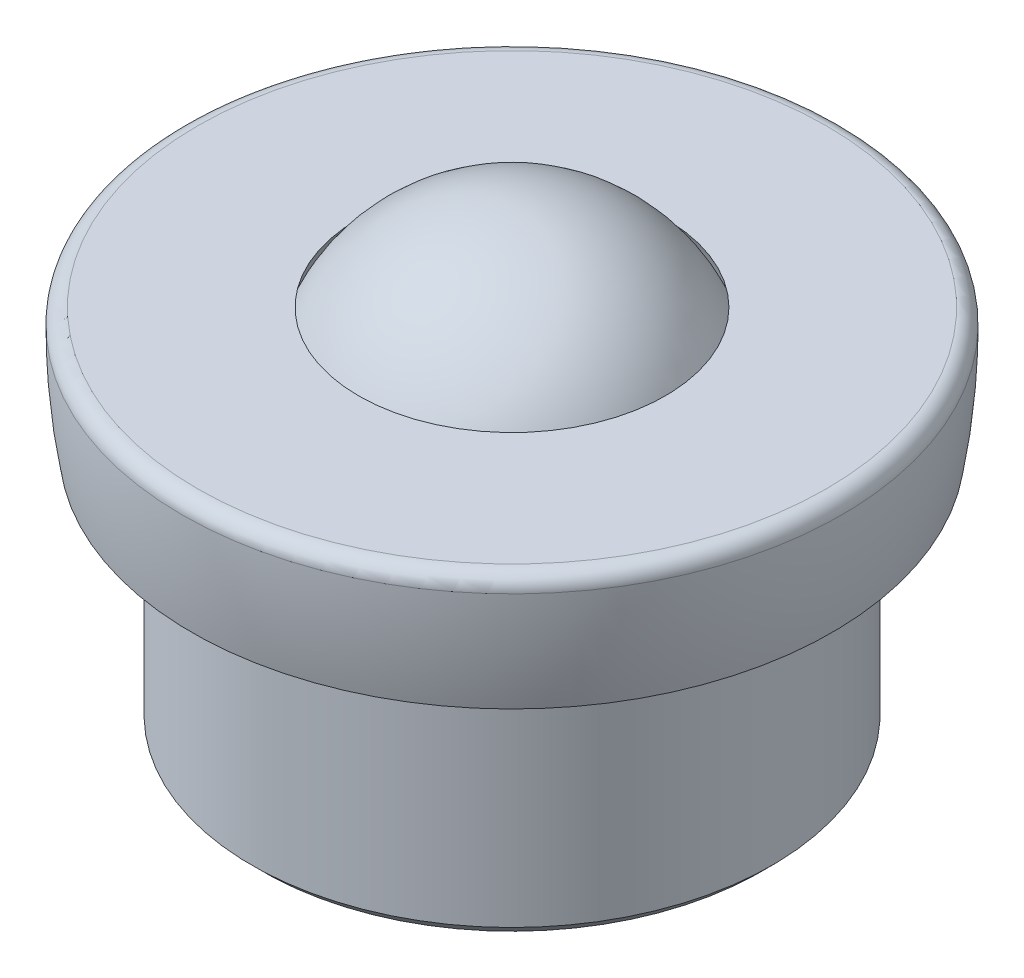
ISO-10303-21;
HEADER;
FILE_DESCRIPTION(('STEP AP214'),'2;1');
FILE_NAME('part.step','',(''),(''),'','','');
FILE_SCHEMA(('AUTOMOTIVE_DESIGN { 1 0 10303 214 1 1 1 1 }'));
ENDSEC;
DATA;
#1=APPLICATION_CONTEXT('core data for automotive mechanical design processes');
#2=APPLICATION_PROTOCOL_DEFINITION('international standard','automotive_design',2000,#1);
#3=PRODUCT_CONTEXT('',#1,'mechanical');
#4=PRODUCT('Part','Part','',(#3));
#5=PRODUCT_RELATED_PRODUCT_CATEGORY('part','',(#4));
#6=PRODUCT_DEFINITION_FORMATION('','',#4);
#7=PRODUCT_DEFINITION_CONTEXT('part definition',#1,'design');
#8=PRODUCT_DEFINITION('design','',#6,#7);
#9=PRODUCT_DEFINITION_SHAPE('','',#8);
#10=(LENGTH_UNIT() NAMED_UNIT(*) SI_UNIT(.MILLI.,.METRE.));
#11=(NAMED_UNIT(*) PLANE_ANGLE_UNIT() SI_UNIT($,.RADIAN.));
#12=(NAMED_UNIT(*) SI_UNIT($,.STERADIAN.) SOLID_ANGLE_UNIT());
#13=UNCERTAINTY_MEASURE_WITH_UNIT(LENGTH_MEASURE(1.E-05),#10,'distance_accuracy_value','');
#14=(GEOMETRIC_REPRESENTATION_CONTEXT(3) GLOBAL_UNCERTAINTY_ASSIGNED_CONTEXT((#13)) GLOBAL_UNIT_ASSIGNED_CONTEXT((#10,
#11,#12)) REPRESENTATION_CONTEXT('',''));
#15=CARTESIAN_POINT('',(0.,0.,0.));
#16=DIRECTION('',(0.,0.,1.));
#17=DIRECTION('',(1.,0.,0.));
#18=AXIS2_PLACEMENT_3D('',#15,#16,#17);
#19=CARTESIAN_POINT('',(0.,-12.7,-11.39825));
#20=DIRECTION('',(0.,-1.,0.));
#21=DIRECTION('',(0.,0.,-1.));
#22=AXIS2_PLACEMENT_3D('',#19,#20,#21);
#23=PLANE('',#22);
#24=CARTESIAN_POINT('',(0.,-12.7,0.));
#25=DIRECTION('',(0.,-1.,0.));
#26=DIRECTION('',(0.,0.,-1.));
#27=AXIS2_PLACEMENT_3D('',#24,#25,#26);
#28=CIRCLE('',#27,11.39825);
#29=CARTESIAN_POINT('',(0.,-12.7,-11.39825));
#30=VERTEX_POINT('',#29);
#31=EDGE_CURVE('E67',#30,#30,#28,.T.);
#32=ORIENTED_EDGE('',*,*,#31,.T.);
#33=EDGE_LOOP('',(#32));
#34=FACE_BOUND('',#33,.T.);
#35=ADVANCED_FACE('F51',(#34),#23,.T.);
#36=CARTESIAN_POINT('',(0.,0.,0.));
#37=DIRECTION('',(0.,1.,0.));
#38=DIRECTION('',(-1.,0.,0.));
#39=AXIS2_PLACEMENT_3D('',#36,#37,#38);
#40=SPHERICAL_SURFACE('',#39,8.0645);
#41=CARTESIAN_POINT('',(0.,3.96875,0.));
#42=DIRECTION('',(0.,1.,0.));
#43=DIRECTION('',(0.,0.,1.));
#44=AXIS2_PLACEMENT_3D('',#41,#42,#43);
#45=CIRCLE('',#44,7.02034071021485);
#46=CARTESIAN_POINT('',(0.,3.96875,7.02034071021485));
#47=VERTEX_POINT('',#46);
#48=EDGE_CURVE('E13',#47,#47,#45,.F.);
#49=ORIENTED_EDGE('',*,*,#48,.F.);
#50=EDGE_LOOP('',(#49));
#51=FACE_BOUND('',#50,.T.);
#52=ADVANCED_FACE('F100',(#51),#40,.F.);
#53=CARTESIAN_POINT('',(0.,3.96875,0.));
#54=DIRECTION('',(0.,1.,0.));
#55=DIRECTION('',(0.,0.,1.));
#56=AXIS2_PLACEMENT_3D('',#53,#54,#55);
#57=PLANE('',#56);
#58=CARTESIAN_POINT('',(0.,3.96875,0.));
#59=DIRECTION('',(0.,-1.,0.));
#60=DIRECTION('',(0.,0.,-1.));
#61=AXIS2_PLACEMENT_3D('',#58,#59,#60);
#62=CIRCLE('',#61,14.38671875);
#63=CARTESIAN_POINT('',(0.,3.96875,-14.38671875));
#64=VERTEX_POINT('',#63);
#65=EDGE_CURVE('E73',#64,#64,#62,.T.);
#66=ORIENTED_EDGE('',*,*,#65,.F.);
#67=EDGE_LOOP('',(#66));
#68=FACE_BOUND('',#67,.T.);
#69=ORIENTED_EDGE('',*,*,#48,.T.);
#70=EDGE_LOOP('',(#69));
#71=FACE_BOUND('',#70,.T.);
#72=ADVANCED_FACE('F97',(#68,#71),#57,.T.);
#73=CARTESIAN_POINT('',(0.,3.27421875,0.));
#74=DIRECTION('',(0.,-1.,0.));
#75=DIRECTION('',(0.,0.,-1.));
#76=AXIS2_PLACEMENT_3D('',#73,#74,#75);
#77=TOROIDAL_SURFACE('',#76,14.38671875,0.694531249999998);
#78=ORIENTED_EDGE('',*,*,#65,.T.);
#79=EDGE_LOOP('',(#78));
#80=FACE_BOUND('',#79,.T.);
#81=CARTESIAN_POINT('',(0.,3.27421875,0.));
#82=DIRECTION('',(0.,-1.,0.));
#83=DIRECTION('',(0.,0.,-1.));
#84=AXIS2_PLACEMENT_3D('',#81,#82,#83);
#85=CIRCLE('',#84,15.08125);
#86=CARTESIAN_POINT('',(0.,3.27421875,-15.08125));
#87=VERTEX_POINT('',#86);
#88=EDGE_CURVE('E77',#87,#87,#85,.T.);
#89=ORIENTED_EDGE('',*,*,#88,.F.);
#90=EDGE_LOOP('',(#89));
#91=FACE_BOUND('',#90,.T.);
#92=ADVANCED_FACE('F89',(#80,#91),#77,.T.);
#93=CARTESIAN_POINT('',(0.,3.27421874999984,0.));
#94=DIRECTION('',(0.,-1.,0.));
#95=DIRECTION('',(0.,0.,-1.));
#96=AXIS2_PLACEMENT_3D('',#93,#94,#95);
#97=DEGENERATE_TOROIDAL_SURFACE('',#96,12.916272434843,27.997522434843,.F.);
#98=ORIENTED_EDGE('',*,*,#88,.T.);
#99=EDGE_LOOP('',(#98));
#100=FACE_BOUND('',#99,.T.);
#101=CARTESIAN_POINT('',(0.,-1.5875,0.));
#102=DIRECTION('',(0.,-1.,0.));
#103=DIRECTION('',(0.,0.,-1.));
#104=AXIS2_PLACEMENT_3D('',#101,#102,#103);
#105=CIRCLE('',#104,14.6559047241236);
#106=CARTESIAN_POINT('',(0.,-1.5875,-14.6559047241236));
#107=VERTEX_POINT('',#106);
#108=EDGE_CURVE('E64',#107,#107,#105,.T.);
#109=ORIENTED_EDGE('',*,*,#108,.F.);
#110=EDGE_LOOP('',(#109));
#111=FACE_BOUND('',#110,.T.);
#112=ADVANCED_FACE('F87',(#100,#111),#97,.F.);
#113=CARTESIAN_POINT('',(-14.6559047241236,-1.5875,-1.02341635696281E-13));
#114=DIRECTION('',(0.,-1.,0.));
#115=DIRECTION('',(0.,0.,-1.));
#116=AXIS2_PLACEMENT_3D('',#113,#114,#115);
#117=PLANE('',#116);
#118=ORIENTED_EDGE('',*,*,#108,.T.);
#119=EDGE_LOOP('',(#118));
#120=FACE_BOUND('',#119,.T.);
#121=CARTESIAN_POINT('',(0.,-1.5875,0.));
#122=DIRECTION('',(0.,-1.,0.));
#123=DIRECTION('',(0.,0.,-1.));
#124=AXIS2_PLACEMENT_3D('',#121,#122,#123);
#125=CIRCLE('',#124,12.60078125);
#126=CARTESIAN_POINT('',(0.,-1.5875,-12.60078125));
#127=VERTEX_POINT('',#126);
#128=EDGE_CURVE('E54',#127,#127,#125,.T.);
#129=ORIENTED_EDGE('',*,*,#128,.F.);
#130=EDGE_LOOP('',(#129));
#131=FACE_BOUND('',#130,.T.);
#132=ADVANCED_FACE('F84',(#120,#131),#117,.T.);
#133=CARTESIAN_POINT('',(0.,-2.28203125,0.));
#134=DIRECTION('',(0.,-1.,0.));
#135=DIRECTION('',(0.,0.,-1.));
#136=AXIS2_PLACEMENT_3D('',#133,#134,#135);
#137=TOROIDAL_SURFACE('',#136,12.60078125,0.69453125);
#138=ORIENTED_EDGE('',*,*,#128,.T.);
#139=EDGE_LOOP('',(#138));
#140=FACE_BOUND('',#139,.T.);
#141=CARTESIAN_POINT('',(0.,-2.28203125,0.));
#142=DIRECTION('',(0.,-1.,0.));
#143=DIRECTION('',(0.,0.,-1.));
#144=AXIS2_PLACEMENT_3D('',#141,#142,#143);
#145=CIRCLE('',#144,11.90625);
#146=CARTESIAN_POINT('',(0.,-2.28203125,-11.90625));
#147=VERTEX_POINT('',#146);
#148=EDGE_CURVE('E69',#147,#147,#145,.T.);
#149=ORIENTED_EDGE('',*,*,#148,.F.);
#150=EDGE_LOOP('',(#149));
#151=FACE_BOUND('',#150,.T.);
#152=ADVANCED_FACE('F96',(#140,#151),#137,.F.);
#153=CARTESIAN_POINT('',(0.,-31.75,0.));
#154=DIRECTION('',(0.,-1.,0.));
#155=DIRECTION('',(0.,0.,-1.));
#156=AXIS2_PLACEMENT_3D('',#153,#154,#155);
#157=CYLINDRICAL_SURFACE('',#156,11.90625);
#158=CARTESIAN_POINT('',(0.,-12.192,0.));
#159=DIRECTION('',(0.,-1.,0.));
#160=DIRECTION('',(0.,0.,-1.));
#161=AXIS2_PLACEMENT_3D('',#158,#159,#160);
#162=CIRCLE('',#161,11.90625);
#163=CARTESIAN_POINT('',(0.,-12.192,-11.90625));
#164=VERTEX_POINT('',#163);
#165=EDGE_CURVE('E127',#164,#164,#162,.F.);
#166=ORIENTED_EDGE('',*,*,#165,.T.);
#167=EDGE_LOOP('',(#166));
#168=FACE_BOUND('',#167,.T.);
#169=ORIENTED_EDGE('',*,*,#148,.T.);
#170=EDGE_LOOP('',(#169));
#171=FACE_BOUND('',#170,.T.);
#172=ADVANCED_FACE('F116',(#168,#171),#157,.T.);
#173=CARTESIAN_POINT('',(0.,-12.7,0.));
#174=DIRECTION('',(0.,1.,0.));
#175=DIRECTION('',(0.,0.,1.));
#176=AXIS2_PLACEMENT_3D('',#173,#174,#175);
#177=CONICAL_SURFACE('',#176,11.39825,0.785398163397448);
#178=ORIENTED_EDGE('',*,*,#165,.F.);
#179=EDGE_LOOP('',(#178));
#180=FACE_BOUND('',#179,.T.);
#181=ORIENTED_EDGE('',*,*,#31,.F.);
#182=EDGE_LOOP('',(#181));
#183=FACE_BOUND('',#182,.T.);
#184=ADVANCED_FACE('F111',(#180,#183),#177,.T.);
#185=CLOSED_SHELL('',(#35,#52,#72,#92,#112,#132,#152,#172,#184));
#186=MANIFOLD_SOLID_BREP('B2',#185);
#187=CARTESIAN_POINT('',(0.,0.,0.));
#188=DIRECTION('',(0.,1.,0.));
#189=DIRECTION('',(-1.,0.,0.));
#190=AXIS2_PLACEMENT_3D('',#187,#188,#189);
#191=SPHERICAL_SURFACE('',#190,7.9375);
#192=CARTESIAN_POINT('',(0.,7.9375,0.));
#193=VERTEX_POINT('',#192);
#194=VERTEX_LOOP('',#193);
#195=FACE_BOUND('',#194,.T.);
#196=ADVANCED_FACE('F198',(#195),#191,.T.);
#197=CLOSED_SHELL('',(#196));
#198=MANIFOLD_SOLID_BREP('B8',#197);
#199=ADVANCED_BREP_SHAPE_REPRESENTATION('',(#18,#186,#198),#14);
#200=SHAPE_DEFINITION_REPRESENTATION(#9,#199);
ENDSEC;
END-ISO-10303-21;
